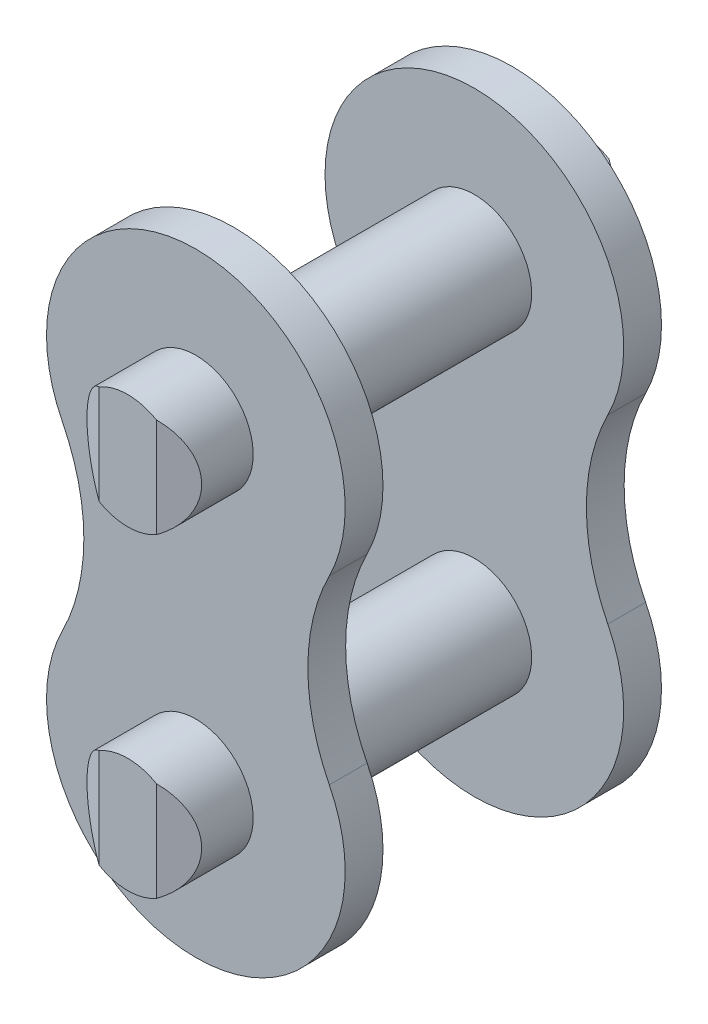
ISO-10303-21;
HEADER;
FILE_DESCRIPTION(('STEP AP214'),'2;1');
FILE_NAME('part.step','',(''),(''),'','','');
FILE_SCHEMA(('AUTOMOTIVE_DESIGN { 1 0 10303 214 1 1 1 1 }'));
ENDSEC;
DATA;
#1=APPLICATION_CONTEXT('core data for automotive mechanical design processes');
#2=APPLICATION_PROTOCOL_DEFINITION('international standard','automotive_design',2000,#1);
#3=PRODUCT_CONTEXT('',#1,'mechanical');
#4=PRODUCT('Part','Part','',(#3));
#5=PRODUCT_RELATED_PRODUCT_CATEGORY('part','',(#4));
#6=PRODUCT_DEFINITION_FORMATION('','',#4);
#7=PRODUCT_DEFINITION_CONTEXT('part definition',#1,'design');
#8=PRODUCT_DEFINITION('design','',#6,#7);
#9=PRODUCT_DEFINITION_SHAPE('','',#8);
#10=(LENGTH_UNIT() NAMED_UNIT(*) SI_UNIT(.MILLI.,.METRE.));
#11=(NAMED_UNIT(*) PLANE_ANGLE_UNIT() SI_UNIT($,.RADIAN.));
#12=(NAMED_UNIT(*) SI_UNIT($,.STERADIAN.) SOLID_ANGLE_UNIT());
#13=UNCERTAINTY_MEASURE_WITH_UNIT(LENGTH_MEASURE(1.E-05),#10,'distance_accuracy_value','');
#14=(GEOMETRIC_REPRESENTATION_CONTEXT(3) GLOBAL_UNCERTAINTY_ASSIGNED_CONTEXT((#13)) GLOBAL_UNIT_ASSIGNED_CONTEXT((#10,
#11,#12)) REPRESENTATION_CONTEXT('',''));
#15=CARTESIAN_POINT('',(0.,0.,0.));
#16=DIRECTION('',(0.,0.,1.));
#17=DIRECTION('',(1.,0.,0.));
#18=AXIS2_PLACEMENT_3D('',#15,#16,#17);
#19=CARTESIAN_POINT('',(133.975475000007,440.089927128475,-131.392489073474));
#20=DIRECTION('',(-0.5,0.,0.866025403784439));
#21=DIRECTION('',(0.,1.,0.));
#22=AXIS2_PLACEMENT_3D('',#19,#20,#21);
#23=PLANE('',#22);
#24=CARTESIAN_POINT('',(133.108700000007,425.587268277526,-131.892921853051));
#25=DIRECTION('',(0.5,0.,-0.866025403784439));
#26=DIRECTION('',(0.866025403784439,0.,0.5));
#27=AXIS2_PLACEMENT_3D('',#24,#25,#26);
#28=ELLIPSE('',#27,1.3344874122049,1.1557);
#29=CARTESIAN_POINT('',(133.686550000007,426.588133836679,-131.5593));
#30=VERTEX_POINT('',#29);
#31=CARTESIAN_POINT('',(133.686550000007,424.586402718372,-131.5593));
#32=VERTEX_POINT('',#31);
#33=EDGE_CURVE('E283',#30,#32,#28,.T.);
#34=ORIENTED_EDGE('',*,*,#33,.T.);
#35=DIRECTION('',(0.,-1.,0.));
#36=VECTOR('',#35,1.);
#37=CARTESIAN_POINT('',(133.686550000007,440.089927128475,-131.5593));
#38=LINE('',#37,#36);
#39=EDGE_CURVE('E238',#30,#32,#38,.T.);
#40=ORIENTED_EDGE('',*,*,#39,.F.);
#41=EDGE_LOOP('',(#34,#40));
#42=FACE_BOUND('',#41,.T.);
#43=ADVANCED_FACE('F17',(#42),#23,.F.);
#44=CARTESIAN_POINT('',(132.241925000007,440.089927128475,-131.392489073474));
#45=DIRECTION('',(-0.5,0.,-0.866025403784439));
#46=DIRECTION('',(-0.866025403784439,0.,0.5));
#47=AXIS2_PLACEMENT_3D('',#44,#45,#46);
#48=PLANE('',#47);
#49=CARTESIAN_POINT('',(133.108700000007,425.587268277526,-131.892921853051));
#50=DIRECTION('',(0.5,0.,0.866025403784439));
#51=DIRECTION('',(-0.866025403784439,0.,0.5));
#52=AXIS2_PLACEMENT_3D('',#49,#50,#51);
#53=ELLIPSE('',#52,1.3344874122049,1.1557);
#54=CARTESIAN_POINT('',(132.530850000007,426.588133836679,-131.5593));
#55=VERTEX_POINT('',#54);
#56=CARTESIAN_POINT('',(132.530850000007,424.586402718372,-131.5593));
#57=VERTEX_POINT('',#56);
#58=EDGE_CURVE('E237',#55,#57,#53,.T.);
#59=ORIENTED_EDGE('',*,*,#58,.F.);
#60=DIRECTION('',(0.,-1.,0.));
#61=VECTOR('',#60,1.);
#62=CARTESIAN_POINT('',(132.530850000007,440.089927128475,-131.5593));
#63=LINE('',#62,#61);
#64=EDGE_CURVE('E240',#55,#57,#63,.T.);
#65=ORIENTED_EDGE('',*,*,#64,.T.);
#66=EDGE_LOOP('',(#59,#65));
#67=FACE_BOUND('',#66,.T.);
#68=ADVANCED_FACE('F19',(#67),#48,.T.);
#69=CARTESIAN_POINT('',(133.975475000007,440.089927128475,-131.392489073474));
#70=DIRECTION('',(-0.5,0.,0.866025403784439));
#71=DIRECTION('',(0.,1.,0.));
#72=AXIS2_PLACEMENT_3D('',#69,#70,#71);
#73=PLANE('',#72);
#74=CARTESIAN_POINT('',(133.108700000007,419.237268277525,-131.892921853051));
#75=DIRECTION('',(0.5,0.,-0.866025403784439));
#76=DIRECTION('',(0.866025403784439,0.,0.5));
#77=AXIS2_PLACEMENT_3D('',#74,#75,#76);
#78=ELLIPSE('',#77,1.3344874122049,1.1557);
#79=CARTESIAN_POINT('',(133.686550000007,420.23813383668,-131.5593));
#80=VERTEX_POINT('',#79);
#81=CARTESIAN_POINT('',(133.686550000007,418.236402718372,-131.5593));
#82=VERTEX_POINT('',#81);
#83=EDGE_CURVE('E311',#80,#82,#78,.T.);
#84=ORIENTED_EDGE('',*,*,#83,.T.);
#85=DIRECTION('',(0.,-1.,0.));
#86=VECTOR('',#85,1.);
#87=CARTESIAN_POINT('',(133.686550000007,440.089927128475,-131.5593));
#88=LINE('',#87,#86);
#89=EDGE_CURVE('E248',#80,#82,#88,.T.);
#90=ORIENTED_EDGE('',*,*,#89,.F.);
#91=EDGE_LOOP('',(#84,#90));
#92=FACE_BOUND('',#91,.T.);
#93=ADVANCED_FACE('F456',(#92),#73,.F.);
#94=CARTESIAN_POINT('',(132.241925000007,440.089927128475,-131.392489073474));
#95=DIRECTION('',(-0.5,0.,-0.866025403784439));
#96=DIRECTION('',(-0.866025403784439,0.,0.5));
#97=AXIS2_PLACEMENT_3D('',#94,#95,#96);
#98=PLANE('',#97);
#99=CARTESIAN_POINT('',(133.108700000007,419.237268277525,-131.892921853051));
#100=DIRECTION('',(0.5,0.,0.866025403784439));
#101=DIRECTION('',(-0.866025403784439,0.,0.5));
#102=AXIS2_PLACEMENT_3D('',#99,#100,#101);
#103=ELLIPSE('',#102,1.3344874122049,1.1557);
#104=CARTESIAN_POINT('',(132.530850000007,420.23813383668,-131.5593));
#105=VERTEX_POINT('',#104);
#106=CARTESIAN_POINT('',(132.530850000007,418.236402718372,-131.5593));
#107=VERTEX_POINT('',#106);
#108=EDGE_CURVE('E291',#105,#107,#103,.T.);
#109=ORIENTED_EDGE('',*,*,#108,.F.);
#110=DIRECTION('',(0.,-1.,0.));
#111=VECTOR('',#110,1.);
#112=CARTESIAN_POINT('',(132.530850000007,440.089927128475,-131.5593));
#113=LINE('',#112,#111);
#114=EDGE_CURVE('E244',#105,#107,#113,.T.);
#115=ORIENTED_EDGE('',*,*,#114,.T.);
#116=EDGE_LOOP('',(#109,#115));
#117=FACE_BOUND('',#116,.T.);
#118=ADVANCED_FACE('F517',(#117),#98,.T.);
#119=CARTESIAN_POINT('',(133.108700000007,422.412268277525,-129.4257));
#120=DIRECTION('',(0.,0.,-1.));
#121=DIRECTION('',(0.,-1.,0.));
#122=AXIS2_PLACEMENT_3D('',#119,#120,#121);
#123=PLANE('',#122);
#124=CARTESIAN_POINT('',(133.108700000007,425.587268277526,-129.4257));
#125=DIRECTION('',(0.,0.,1.));
#126=DIRECTION('',(0.,-1.,0.));
#127=AXIS2_PLACEMENT_3D('',#124,#125,#126);
#128=CIRCLE('',#127,1.1557);
#129=CARTESIAN_POINT('',(133.108700000007,424.431568277526,-129.4257));
#130=VERTEX_POINT('',#129);
#131=EDGE_CURVE('E263',#130,#130,#128,.T.);
#132=ORIENTED_EDGE('',*,*,#131,.F.);
#133=EDGE_LOOP('',(#132));
#134=FACE_BOUND('',#133,.T.);
#135=CARTESIAN_POINT('',(133.108700000007,419.237268277525,-129.4257));
#136=DIRECTION('',(0.,0.,1.));
#137=DIRECTION('',(0.,-1.,0.));
#138=AXIS2_PLACEMENT_3D('',#135,#136,#137);
#139=CIRCLE('',#138,1.1557);
#140=CARTESIAN_POINT('',(133.108700000007,418.081568277526,-129.4257));
#141=VERTEX_POINT('',#140);
#142=EDGE_CURVE('E267',#141,#141,#139,.T.);
#143=ORIENTED_EDGE('',*,*,#142,.F.);
#144=EDGE_LOOP('',(#143));
#145=FACE_BOUND('',#144,.T.);
#146=CARTESIAN_POINT('',(126.78662526372,422.412268277525,-129.4257));
#147=DIRECTION('',(0.,0.,1.));
#148=DIRECTION('',(0.,-1.,0.));
#149=AXIS2_PLACEMENT_3D('',#146,#147,#148);
#150=CIRCLE('',#149,4.06464973628698);
#151=CARTESIAN_POINT('',(130.418943979048,420.588086754493,-129.4257));
#152=VERTEX_POINT('',#151);
#153=CARTESIAN_POINT('',(130.418943979048,424.236449800559,-129.4257));
#154=VERTEX_POINT('',#153);
#155=EDGE_CURVE('E247',#152,#154,#150,.T.);
#156=ORIENTED_EDGE('',*,*,#155,.F.);
#157=CARTESIAN_POINT('',(133.108700000007,419.237268277525,-129.4257));
#158=DIRECTION('',(0.,0.,1.));
#159=DIRECTION('',(0.,-1.,0.));
#160=AXIS2_PLACEMENT_3D('',#157,#158,#159);
#161=CIRCLE('',#160,3.0099);
#162=CARTESIAN_POINT('',(135.798456020965,420.588086754493,-129.4257));
#163=VERTEX_POINT('',#162);
#164=EDGE_CURVE('E330',#152,#163,#161,.T.);
#165=ORIENTED_EDGE('',*,*,#164,.T.);
#166=CARTESIAN_POINT('',(139.430774736293,422.412268277525,-129.4257));
#167=DIRECTION('',(0.,0.,1.));
#168=DIRECTION('',(0.,-1.,0.));
#169=AXIS2_PLACEMENT_3D('',#166,#167,#168);
#170=CIRCLE('',#169,4.06464973628691);
#171=CARTESIAN_POINT('',(135.798456020965,424.236449800559,-129.4257));
#172=VERTEX_POINT('',#171);
#173=EDGE_CURVE('E304',#172,#163,#170,.T.);
#174=ORIENTED_EDGE('',*,*,#173,.F.);
#175=CARTESIAN_POINT('',(133.108700000007,425.587268277526,-129.4257));
#176=DIRECTION('',(0.,0.,1.));
#177=DIRECTION('',(0.,-1.,0.));
#178=AXIS2_PLACEMENT_3D('',#175,#176,#177);
#179=CIRCLE('',#178,3.0099);
#180=EDGE_CURVE('E26',#172,#154,#179,.T.);
#181=ORIENTED_EDGE('',*,*,#180,.T.);
#182=EDGE_LOOP('',(#156,#165,#174,#181));
#183=FACE_BOUND('',#182,.T.);
#184=ADVANCED_FACE('F513',(#134,#145,#183),#123,.F.);
#185=CARTESIAN_POINT('',(133.108700000007,422.412268277525,-130.1877));
#186=DIRECTION('',(0.,0.,-1.));
#187=DIRECTION('',(0.,-1.,0.));
#188=AXIS2_PLACEMENT_3D('',#185,#186,#187);
#189=PLANE('',#188);
#190=CARTESIAN_POINT('',(133.108700000007,425.587268277526,-130.1877));
#191=DIRECTION('',(0.,0.,1.));
#192=DIRECTION('',(0.,-1.,0.));
#193=AXIS2_PLACEMENT_3D('',#190,#191,#192);
#194=CIRCLE('',#193,1.1557);
#195=CARTESIAN_POINT('',(133.108700000007,424.431568277526,-130.1877));
#196=VERTEX_POINT('',#195);
#197=EDGE_CURVE('E266',#196,#196,#194,.T.);
#198=ORIENTED_EDGE('',*,*,#197,.T.);
#199=EDGE_LOOP('',(#198));
#200=FACE_BOUND('',#199,.T.);
#201=CARTESIAN_POINT('',(133.108700000007,419.237268277525,-130.1877));
#202=DIRECTION('',(0.,0.,1.));
#203=DIRECTION('',(0.,-1.,0.));
#204=AXIS2_PLACEMENT_3D('',#201,#202,#203);
#205=CIRCLE('',#204,1.1557);
#206=CARTESIAN_POINT('',(133.108700000007,418.081568277526,-130.1877));
#207=VERTEX_POINT('',#206);
#208=EDGE_CURVE('E308',#207,#207,#205,.T.);
#209=ORIENTED_EDGE('',*,*,#208,.T.);
#210=EDGE_LOOP('',(#209));
#211=FACE_BOUND('',#210,.T.);
#212=CARTESIAN_POINT('',(126.78662526372,422.412268277525,-130.1877));
#213=DIRECTION('',(0.,0.,1.));
#214=DIRECTION('',(0.,-1.,0.));
#215=AXIS2_PLACEMENT_3D('',#212,#213,#214);
#216=CIRCLE('',#215,4.06464973628698);
#217=CARTESIAN_POINT('',(130.418943979048,420.588086754493,-130.1877));
#218=VERTEX_POINT('',#217);
#219=CARTESIAN_POINT('',(130.418943979048,424.236449800559,-130.1877));
#220=VERTEX_POINT('',#219);
#221=EDGE_CURVE('E323',#218,#220,#216,.T.);
#222=ORIENTED_EDGE('',*,*,#221,.T.);
#223=CARTESIAN_POINT('',(133.108700000007,425.587268277526,-130.1877));
#224=DIRECTION('',(0.,0.,1.));
#225=DIRECTION('',(0.,-1.,0.));
#226=AXIS2_PLACEMENT_3D('',#223,#224,#225);
#227=CIRCLE('',#226,3.0099);
#228=CARTESIAN_POINT('',(135.798456020965,424.236449800559,-130.1877));
#229=VERTEX_POINT('',#228);
#230=EDGE_CURVE('E11',#229,#220,#227,.T.);
#231=ORIENTED_EDGE('',*,*,#230,.F.);
#232=CARTESIAN_POINT('',(139.430774736293,422.412268277525,-130.1877));
#233=DIRECTION('',(0.,0.,1.));
#234=DIRECTION('',(0.,-1.,0.));
#235=AXIS2_PLACEMENT_3D('',#232,#233,#234);
#236=CIRCLE('',#235,4.06464973628691);
#237=CARTESIAN_POINT('',(135.798456020965,420.588086754493,-130.1877));
#238=VERTEX_POINT('',#237);
#239=EDGE_CURVE('E338',#229,#238,#236,.T.);
#240=ORIENTED_EDGE('',*,*,#239,.T.);
#241=CARTESIAN_POINT('',(133.108700000007,419.237268277525,-130.1877));
#242=DIRECTION('',(0.,0.,1.));
#243=DIRECTION('',(0.,-1.,0.));
#244=AXIS2_PLACEMENT_3D('',#241,#242,#243);
#245=CIRCLE('',#244,3.0099);
#246=EDGE_CURVE('E305',#218,#238,#245,.T.);
#247=ORIENTED_EDGE('',*,*,#246,.F.);
#248=EDGE_LOOP('',(#222,#231,#240,#247));
#249=FACE_BOUND('',#248,.T.);
#250=ADVANCED_FACE('F516',(#200,#211,#249),#189,.T.);
#251=CARTESIAN_POINT('',(133.108700000007,425.587268277526,-130.1877));
#252=DIRECTION('',(0.,0.,1.));
#253=DIRECTION('',(0.,1.,0.));
#254=AXIS2_PLACEMENT_3D('',#251,#252,#253);
#255=CYLINDRICAL_SURFACE('',#254,3.0099);
#256=ORIENTED_EDGE('',*,*,#180,.F.);
#257=DIRECTION('',(0.,0.,1.));
#258=VECTOR('',#257,1.);
#259=CARTESIAN_POINT('',(135.798456020965,424.236449800559,-130.1877));
#260=LINE('',#259,#258);
#261=EDGE_CURVE('E336',#229,#172,#260,.T.);
#262=ORIENTED_EDGE('',*,*,#261,.F.);
#263=ORIENTED_EDGE('',*,*,#230,.T.);
#264=DIRECTION('',(0.,0.,1.));
#265=VECTOR('',#264,1.);
#266=CARTESIAN_POINT('',(130.418943979048,424.236449800559,-130.1877));
#267=LINE('',#266,#265);
#268=EDGE_CURVE('E320',#220,#154,#267,.T.);
#269=ORIENTED_EDGE('',*,*,#268,.T.);
#270=EDGE_LOOP('',(#256,#262,#263,#269));
#271=FACE_BOUND('',#270,.T.);
#272=ADVANCED_FACE('F536',(#271),#255,.T.);
#273=CARTESIAN_POINT('',(139.430774736293,422.412268277525,-130.1877));
#274=DIRECTION('',(0.,0.,1.));
#275=DIRECTION('',(0.,1.,0.));
#276=AXIS2_PLACEMENT_3D('',#273,#274,#275);
#277=CYLINDRICAL_SURFACE('',#276,4.06464973628691);
#278=ORIENTED_EDGE('',*,*,#173,.T.);
#279=DIRECTION('',(0.,0.,1.));
#280=VECTOR('',#279,1.);
#281=CARTESIAN_POINT('',(135.798456020965,420.588086754493,-130.1877));
#282=LINE('',#281,#280);
#283=EDGE_CURVE('E300',#238,#163,#282,.T.);
#284=ORIENTED_EDGE('',*,*,#283,.F.);
#285=ORIENTED_EDGE('',*,*,#239,.F.);
#286=ORIENTED_EDGE('',*,*,#261,.T.);
#287=EDGE_LOOP('',(#278,#284,#285,#286));
#288=FACE_BOUND('',#287,.T.);
#289=ADVANCED_FACE('F532',(#288),#277,.F.);
#290=CARTESIAN_POINT('',(133.108700000007,419.237268277525,-130.1877));
#291=DIRECTION('',(0.,0.,1.));
#292=DIRECTION('',(0.,1.,0.));
#293=AXIS2_PLACEMENT_3D('',#290,#291,#292);
#294=CYLINDRICAL_SURFACE('',#293,3.0099);
#295=ORIENTED_EDGE('',*,*,#164,.F.);
#296=DIRECTION('',(0.,0.,1.));
#297=VECTOR('',#296,1.);
#298=CARTESIAN_POINT('',(130.418943979048,420.588086754493,-130.1877));
#299=LINE('',#298,#297);
#300=EDGE_CURVE('E326',#218,#152,#299,.T.);
#301=ORIENTED_EDGE('',*,*,#300,.F.);
#302=ORIENTED_EDGE('',*,*,#246,.T.);
#303=ORIENTED_EDGE('',*,*,#283,.T.);
#304=EDGE_LOOP('',(#295,#301,#302,#303));
#305=FACE_BOUND('',#304,.T.);
#306=ADVANCED_FACE('F528',(#305),#294,.T.);
#307=CARTESIAN_POINT('',(126.78662526372,422.412268277525,-130.1877));
#308=DIRECTION('',(0.,0.,1.));
#309=DIRECTION('',(0.,1.,0.));
#310=AXIS2_PLACEMENT_3D('',#307,#308,#309);
#311=CYLINDRICAL_SURFACE('',#310,4.06464973628698);
#312=ORIENTED_EDGE('',*,*,#155,.T.);
#313=ORIENTED_EDGE('',*,*,#268,.F.);
#314=ORIENTED_EDGE('',*,*,#221,.F.);
#315=ORIENTED_EDGE('',*,*,#300,.T.);
#316=EDGE_LOOP('',(#312,#313,#314,#315));
#317=FACE_BOUND('',#316,.T.);
#318=ADVANCED_FACE('F524',(#317),#311,.F.);
#319=CARTESIAN_POINT('',(133.108700000007,422.412268277525,-131.5593));
#320=DIRECTION('',(0.,0.,-1.));
#321=DIRECTION('',(0.,-1.,0.));
#322=AXIS2_PLACEMENT_3D('',#319,#320,#321);
#323=PLANE('',#322);
#324=ORIENTED_EDGE('',*,*,#89,.T.);
#325=CARTESIAN_POINT('',(133.108700000007,419.237268277525,-131.5593));
#326=DIRECTION('',(0.,0.,1.));
#327=DIRECTION('',(0.,-1.,0.));
#328=AXIS2_PLACEMENT_3D('',#325,#326,#327);
#329=CIRCLE('',#328,1.1557);
#330=EDGE_CURVE('E295',#107,#82,#329,.T.);
#331=ORIENTED_EDGE('',*,*,#330,.F.);
#332=ORIENTED_EDGE('',*,*,#114,.F.);
#333=CARTESIAN_POINT('',(133.108700000007,419.237268277525,-131.5593));
#334=DIRECTION('',(0.,0.,1.));
#335=DIRECTION('',(0.,-1.,0.));
#336=AXIS2_PLACEMENT_3D('',#333,#334,#335);
#337=CIRCLE('',#336,1.1557);
#338=EDGE_CURVE('E296',#80,#105,#337,.T.);
#339=ORIENTED_EDGE('',*,*,#338,.F.);
#340=EDGE_LOOP('',(#324,#331,#332,#339));
#341=FACE_BOUND('',#340,.T.);
#342=ADVANCED_FACE('F521',(#341),#323,.T.);
#343=CARTESIAN_POINT('',(133.108700000007,419.237268277525,-131.5593));
#344=DIRECTION('',(0.,0.,1.));
#345=DIRECTION('',(0.,1.,0.));
#346=AXIS2_PLACEMENT_3D('',#343,#344,#345);
#347=CYLINDRICAL_SURFACE('',#346,1.1557);
#348=ORIENTED_EDGE('',*,*,#83,.F.);
#349=ORIENTED_EDGE('',*,*,#338,.T.);
#350=ORIENTED_EDGE('',*,*,#108,.T.);
#351=ORIENTED_EDGE('',*,*,#330,.T.);
#352=EDGE_LOOP('',(#348,#349,#350,#351));
#353=FACE_BOUND('',#352,.T.);
#354=ORIENTED_EDGE('',*,*,#208,.F.);
#355=EDGE_LOOP('',(#354));
#356=FACE_BOUND('',#355,.T.);
#357=ADVANCED_FACE('F508',(#353,#356),#347,.T.);
#358=CARTESIAN_POINT('',(133.108700000007,422.412268277525,-131.5593));
#359=DIRECTION('',(0.,0.,-1.));
#360=DIRECTION('',(0.,-1.,0.));
#361=AXIS2_PLACEMENT_3D('',#358,#359,#360);
#362=PLANE('',#361);
#363=ORIENTED_EDGE('',*,*,#39,.T.);
#364=CARTESIAN_POINT('',(133.108700000007,425.587268277526,-131.5593));
#365=DIRECTION('',(0.,0.,1.));
#366=DIRECTION('',(0.,-1.,0.));
#367=AXIS2_PLACEMENT_3D('',#364,#365,#366);
#368=CIRCLE('',#367,1.1557);
#369=EDGE_CURVE('E241',#57,#32,#368,.T.);
#370=ORIENTED_EDGE('',*,*,#369,.F.);
#371=ORIENTED_EDGE('',*,*,#64,.F.);
#372=CARTESIAN_POINT('',(133.108700000007,425.587268277526,-131.5593));
#373=DIRECTION('',(0.,0.,1.));
#374=DIRECTION('',(0.,-1.,0.));
#375=AXIS2_PLACEMENT_3D('',#372,#373,#374);
#376=CIRCLE('',#375,1.1557);
#377=EDGE_CURVE('E287',#30,#55,#376,.T.);
#378=ORIENTED_EDGE('',*,*,#377,.F.);
#379=EDGE_LOOP('',(#363,#370,#371,#378));
#380=FACE_BOUND('',#379,.T.);
#381=ADVANCED_FACE('F505',(#380),#362,.T.);
#382=CARTESIAN_POINT('',(133.108700000007,425.587268277526,-131.5593));
#383=DIRECTION('',(0.,0.,1.));
#384=DIRECTION('',(0.,1.,0.));
#385=AXIS2_PLACEMENT_3D('',#382,#383,#384);
#386=CYLINDRICAL_SURFACE('',#385,1.1557);
#387=ORIENTED_EDGE('',*,*,#33,.F.);
#388=ORIENTED_EDGE('',*,*,#377,.T.);
#389=ORIENTED_EDGE('',*,*,#58,.T.);
#390=ORIENTED_EDGE('',*,*,#369,.T.);
#391=EDGE_LOOP('',(#387,#388,#389,#390));
#392=FACE_BOUND('',#391,.T.);
#393=ORIENTED_EDGE('',*,*,#197,.F.);
#394=EDGE_LOOP('',(#393));
#395=FACE_BOUND('',#394,.T.);
#396=ADVANCED_FACE('F445',(#392,#395),#386,.T.);
#397=CARTESIAN_POINT('',(133.975475000007,440.089927128475,-122.607510926526));
#398=DIRECTION('',(-0.5,0.,-0.866025403784439));
#399=DIRECTION('',(-0.866025403784439,0.,0.5));
#400=AXIS2_PLACEMENT_3D('',#397,#398,#399);
#401=PLANE('',#400);
#402=CARTESIAN_POINT('',(133.108700000007,425.587268277526,-122.107078146949));
#403=DIRECTION('',(-0.5,0.,-0.866025403784439));
#404=DIRECTION('',(0.866025403784439,0.,-0.5));
#405=AXIS2_PLACEMENT_3D('',#402,#403,#404);
#406=ELLIPSE('',#405,1.3344874122049,1.1557);
#407=CARTESIAN_POINT('',(133.686550000007,426.588133836679,-122.4407));
#408=VERTEX_POINT('',#407);
#409=CARTESIAN_POINT('',(133.686550000007,424.586402718372,-122.4407));
#410=VERTEX_POINT('',#409);
#411=EDGE_CURVE('E385',#408,#410,#406,.T.);
#412=ORIENTED_EDGE('',*,*,#411,.F.);
#413=DIRECTION('',(0.,-1.,0.));
#414=VECTOR('',#413,1.);
#415=CARTESIAN_POINT('',(133.686550000007,440.089927128475,-122.4407));
#416=LINE('',#415,#414);
#417=EDGE_CURVE('E355',#408,#410,#416,.T.);
#418=ORIENTED_EDGE('',*,*,#417,.T.);
#419=EDGE_LOOP('',(#412,#418));
#420=FACE_BOUND('',#419,.T.);
#421=ADVANCED_FACE('F435',(#420),#401,.F.);
#422=CARTESIAN_POINT('',(132.241925000007,440.089927128475,-122.607510926526));
#423=DIRECTION('',(-0.5,0.,0.866025403784439));
#424=DIRECTION('',(0.,1.,0.));
#425=AXIS2_PLACEMENT_3D('',#422,#423,#424);
#426=PLANE('',#425);
#427=CARTESIAN_POINT('',(133.108700000007,425.587268277526,-122.107078146949));
#428=DIRECTION('',(-0.5,0.,0.866025403784439));
#429=DIRECTION('',(-0.866025403784439,0.,-0.5));
#430=AXIS2_PLACEMENT_3D('',#427,#428,#429);
#431=ELLIPSE('',#430,1.3344874122049,1.1557);
#432=CARTESIAN_POINT('',(132.530850000007,426.588133836679,-122.4407));
#433=VERTEX_POINT('',#432);
#434=CARTESIAN_POINT('',(132.530850000007,424.586402718372,-122.4407));
#435=VERTEX_POINT('',#434);
#436=EDGE_CURVE('E388',#433,#435,#431,.T.);
#437=ORIENTED_EDGE('',*,*,#436,.T.);
#438=DIRECTION('',(0.,-1.,0.));
#439=VECTOR('',#438,1.);
#440=CARTESIAN_POINT('',(132.530850000007,440.089927128475,-122.4407));
#441=LINE('',#440,#439);
#442=EDGE_CURVE('E357',#433,#435,#441,.T.);
#443=ORIENTED_EDGE('',*,*,#442,.F.);
#444=EDGE_LOOP('',(#437,#443));
#445=FACE_BOUND('',#444,.T.);
#446=ADVANCED_FACE('F432',(#445),#426,.T.);
#447=CARTESIAN_POINT('',(133.975475000007,440.089927128475,-122.607510926526));
#448=DIRECTION('',(-0.5,0.,-0.866025403784439));
#449=DIRECTION('',(-0.866025403784439,0.,0.5));
#450=AXIS2_PLACEMENT_3D('',#447,#448,#449);
#451=PLANE('',#450);
#452=CARTESIAN_POINT('',(133.108700000007,419.237268277525,-122.107078146949));
#453=DIRECTION('',(-0.5,0.,-0.866025403784439));
#454=DIRECTION('',(0.866025403784439,0.,-0.5));
#455=AXIS2_PLACEMENT_3D('',#452,#453,#454);
#456=ELLIPSE('',#455,1.3344874122049,1.1557);
#457=CARTESIAN_POINT('',(133.686550000007,420.23813383668,-122.4407));
#458=VERTEX_POINT('',#457);
#459=CARTESIAN_POINT('',(133.686550000007,418.236402718372,-122.4407));
#460=VERTEX_POINT('',#459);
#461=EDGE_CURVE('E362',#458,#460,#456,.T.);
#462=ORIENTED_EDGE('',*,*,#461,.F.);
#463=DIRECTION('',(0.,-1.,0.));
#464=VECTOR('',#463,1.);
#465=CARTESIAN_POINT('',(133.686550000007,440.089927128475,-122.4407));
#466=LINE('',#465,#464);
#467=EDGE_CURVE('E233',#458,#460,#466,.T.);
#468=ORIENTED_EDGE('',*,*,#467,.T.);
#469=EDGE_LOOP('',(#462,#468));
#470=FACE_BOUND('',#469,.T.);
#471=ADVANCED_FACE('F434',(#470),#451,.F.);
#472=CARTESIAN_POINT('',(132.241925000007,440.089927128475,-122.607510926526));
#473=DIRECTION('',(-0.5,0.,0.866025403784439));
#474=DIRECTION('',(0.,1.,0.));
#475=AXIS2_PLACEMENT_3D('',#472,#473,#474);
#476=PLANE('',#475);
#477=CARTESIAN_POINT('',(133.108700000007,419.237268277525,-122.107078146949));
#478=DIRECTION('',(-0.5,0.,0.866025403784439));
#479=DIRECTION('',(-0.866025403784439,0.,-0.5));
#480=AXIS2_PLACEMENT_3D('',#477,#478,#479);
#481=ELLIPSE('',#480,1.3344874122049,1.1557);
#482=CARTESIAN_POINT('',(132.530850000007,420.23813383668,-122.4407));
#483=VERTEX_POINT('',#482);
#484=CARTESIAN_POINT('',(132.530850000007,418.236402718372,-122.4407));
#485=VERTEX_POINT('',#484);
#486=EDGE_CURVE('E366',#483,#485,#481,.T.);
#487=ORIENTED_EDGE('',*,*,#486,.T.);
#488=DIRECTION('',(0.,-1.,0.));
#489=VECTOR('',#488,1.);
#490=CARTESIAN_POINT('',(132.530850000007,440.089927128475,-122.4407));
#491=LINE('',#490,#489);
#492=EDGE_CURVE('E227',#483,#485,#491,.T.);
#493=ORIENTED_EDGE('',*,*,#492,.F.);
#494=EDGE_LOOP('',(#487,#493));
#495=FACE_BOUND('',#494,.T.);
#496=ADVANCED_FACE('F442',(#495),#476,.T.);
#497=CARTESIAN_POINT('',(133.108700000007,425.587268277526,-122.4407));
#498=DIRECTION('',(0.,0.,-1.));
#499=DIRECTION('',(0.,1.,0.));
#500=AXIS2_PLACEMENT_3D('',#497,#498,#499);
#501=CYLINDRICAL_SURFACE('',#500,1.1557);
#502=ORIENTED_EDGE('',*,*,#131,.T.);
#503=EDGE_LOOP('',(#502));
#504=FACE_BOUND('',#503,.T.);
#505=CARTESIAN_POINT('',(133.108700000007,425.587268277526,-124.5743));
#506=DIRECTION('',(0.,0.,1.));
#507=DIRECTION('',(0.,-1.,0.));
#508=AXIS2_PLACEMENT_3D('',#505,#506,#507);
#509=CIRCLE('',#508,1.1557);
#510=CARTESIAN_POINT('',(133.108700000007,424.431568277526,-124.5743));
#511=VERTEX_POINT('',#510);
#512=EDGE_CURVE('E278',#511,#511,#509,.T.);
#513=ORIENTED_EDGE('',*,*,#512,.F.);
#514=EDGE_LOOP('',(#513));
#515=FACE_BOUND('',#514,.T.);
#516=ADVANCED_FACE('F498',(#504,#515),#501,.T.);
#517=CARTESIAN_POINT('',(133.108700000007,419.237268277525,-122.4407));
#518=DIRECTION('',(0.,0.,-1.));
#519=DIRECTION('',(0.,1.,0.));
#520=AXIS2_PLACEMENT_3D('',#517,#518,#519);
#521=CYLINDRICAL_SURFACE('',#520,1.1557);
#522=ORIENTED_EDGE('',*,*,#142,.T.);
#523=EDGE_LOOP('',(#522));
#524=FACE_BOUND('',#523,.T.);
#525=CARTESIAN_POINT('',(133.108700000007,419.237268277525,-124.5743));
#526=DIRECTION('',(0.,0.,1.));
#527=DIRECTION('',(0.,-1.,0.));
#528=AXIS2_PLACEMENT_3D('',#525,#526,#527);
#529=CIRCLE('',#528,1.1557);
#530=CARTESIAN_POINT('',(133.108700000007,418.081568277526,-124.5743));
#531=VERTEX_POINT('',#530);
#532=EDGE_CURVE('E252',#531,#531,#529,.T.);
#533=ORIENTED_EDGE('',*,*,#532,.F.);
#534=EDGE_LOOP('',(#533));
#535=FACE_BOUND('',#534,.T.);
#536=ADVANCED_FACE('F495',(#524,#535),#521,.T.);
#537=CARTESIAN_POINT('',(133.108700000007,422.412268277525,-124.5743));
#538=DIRECTION('',(0.,0.,1.));
#539=DIRECTION('',(1.,0.,0.));
#540=AXIS2_PLACEMENT_3D('',#537,#538,#539);
#541=PLANE('',#540);
#542=ORIENTED_EDGE('',*,*,#512,.T.);
#543=EDGE_LOOP('',(#542));
#544=FACE_BOUND('',#543,.T.);
#545=ORIENTED_EDGE('',*,*,#532,.T.);
#546=EDGE_LOOP('',(#545));
#547=FACE_BOUND('',#546,.T.);
#548=CARTESIAN_POINT('',(126.78662526372,422.412268277525,-124.5743));
#549=DIRECTION('',(0.,0.,1.));
#550=DIRECTION('',(0.,-1.,0.));
#551=AXIS2_PLACEMENT_3D('',#548,#549,#550);
#552=CIRCLE('',#551,4.06464973628698);
#553=CARTESIAN_POINT('',(130.418943979048,420.588086754493,-124.5743));
#554=VERTEX_POINT('',#553);
#555=CARTESIAN_POINT('',(130.418943979048,424.236449800559,-124.5743));
#556=VERTEX_POINT('',#555);
#557=EDGE_CURVE('E202',#554,#556,#552,.T.);
#558=ORIENTED_EDGE('',*,*,#557,.T.);
#559=CARTESIAN_POINT('',(133.108700000007,425.587268277526,-124.5743));
#560=DIRECTION('',(0.,0.,1.));
#561=DIRECTION('',(0.,-1.,0.));
#562=AXIS2_PLACEMENT_3D('',#559,#560,#561);
#563=CIRCLE('',#562,3.0099);
#564=CARTESIAN_POINT('',(135.798456020965,424.236449800559,-124.5743));
#565=VERTEX_POINT('',#564);
#566=EDGE_CURVE('E253',#565,#556,#563,.T.);
#567=ORIENTED_EDGE('',*,*,#566,.F.);
#568=CARTESIAN_POINT('',(139.430774736293,422.412268277525,-124.5743));
#569=DIRECTION('',(0.,0.,1.));
#570=DIRECTION('',(0.,-1.,0.));
#571=AXIS2_PLACEMENT_3D('',#568,#569,#570);
#572=CIRCLE('',#571,4.06464973628691);
#573=CARTESIAN_POINT('',(135.798456020965,420.588086754493,-124.5743));
#574=VERTEX_POINT('',#573);
#575=EDGE_CURVE('E204',#565,#574,#572,.T.);
#576=ORIENTED_EDGE('',*,*,#575,.T.);
#577=CARTESIAN_POINT('',(133.108700000007,419.237268277525,-124.5743));
#578=DIRECTION('',(0.,0.,1.));
#579=DIRECTION('',(0.,-1.,0.));
#580=AXIS2_PLACEMENT_3D('',#577,#578,#579);
#581=CIRCLE('',#580,3.0099);
#582=EDGE_CURVE('E198',#554,#574,#581,.T.);
#583=ORIENTED_EDGE('',*,*,#582,.F.);
#584=EDGE_LOOP('',(#558,#567,#576,#583));
#585=FACE_BOUND('',#584,.T.);
#586=ADVANCED_FACE('F200',(#544,#547,#585),#541,.F.);
#587=CARTESIAN_POINT('',(133.108700000007,422.412268277525,-123.8123));
#588=DIRECTION('',(0.,0.,1.));
#589=DIRECTION('',(1.,0.,0.));
#590=AXIS2_PLACEMENT_3D('',#587,#588,#589);
#591=PLANE('',#590);
#592=CARTESIAN_POINT('',(133.108700000007,425.587268277526,-123.8123));
#593=DIRECTION('',(0.,0.,1.));
#594=DIRECTION('',(0.,-1.,0.));
#595=AXIS2_PLACEMENT_3D('',#592,#593,#594);
#596=CIRCLE('',#595,1.1557);
#597=CARTESIAN_POINT('',(133.108700000007,424.431568277526,-123.8123));
#598=VERTEX_POINT('',#597);
#599=EDGE_CURVE('E414',#598,#598,#596,.T.);
#600=ORIENTED_EDGE('',*,*,#599,.F.);
#601=EDGE_LOOP('',(#600));
#602=FACE_BOUND('',#601,.T.);
#603=CARTESIAN_POINT('',(133.108700000007,419.237268277525,-123.8123));
#604=DIRECTION('',(0.,0.,1.));
#605=DIRECTION('',(0.,-1.,0.));
#606=AXIS2_PLACEMENT_3D('',#603,#604,#605);
#607=CIRCLE('',#606,1.1557);
#608=CARTESIAN_POINT('',(133.108700000007,418.081568277526,-123.8123));
#609=VERTEX_POINT('',#608);
#610=EDGE_CURVE('E359',#609,#609,#607,.T.);
#611=ORIENTED_EDGE('',*,*,#610,.F.);
#612=EDGE_LOOP('',(#611));
#613=FACE_BOUND('',#612,.T.);
#614=CARTESIAN_POINT('',(126.78662526372,422.412268277525,-123.8123));
#615=DIRECTION('',(0.,0.,1.));
#616=DIRECTION('',(0.,-1.,0.));
#617=AXIS2_PLACEMENT_3D('',#614,#615,#616);
#618=CIRCLE('',#617,4.06464973628698);
#619=CARTESIAN_POINT('',(130.418943979048,420.588086754493,-123.8123));
#620=VERTEX_POINT('',#619);
#621=CARTESIAN_POINT('',(130.418943979048,424.236449800559,-123.8123));
#622=VERTEX_POINT('',#621);
#623=EDGE_CURVE('E221',#620,#622,#618,.T.);
#624=ORIENTED_EDGE('',*,*,#623,.F.);
#625=CARTESIAN_POINT('',(133.108700000007,419.237268277525,-123.8123));
#626=DIRECTION('',(0.,0.,1.));
#627=DIRECTION('',(0.,-1.,0.));
#628=AXIS2_PLACEMENT_3D('',#625,#626,#627);
#629=CIRCLE('',#628,3.0099);
#630=CARTESIAN_POINT('',(135.798456020965,420.588086754493,-123.8123));
#631=VERTEX_POINT('',#630);
#632=EDGE_CURVE('E216',#620,#631,#629,.T.);
#633=ORIENTED_EDGE('',*,*,#632,.T.);
#634=CARTESIAN_POINT('',(139.430774736293,422.412268277525,-123.8123));
#635=DIRECTION('',(0.,0.,1.));
#636=DIRECTION('',(0.,-1.,0.));
#637=AXIS2_PLACEMENT_3D('',#634,#635,#636);
#638=CIRCLE('',#637,4.06464973628691);
#639=CARTESIAN_POINT('',(135.798456020965,424.236449800559,-123.8123));
#640=VERTEX_POINT('',#639);
#641=EDGE_CURVE('E259',#640,#631,#638,.T.);
#642=ORIENTED_EDGE('',*,*,#641,.F.);
#643=CARTESIAN_POINT('',(133.108700000007,425.587268277526,-123.8123));
#644=DIRECTION('',(0.,0.,1.));
#645=DIRECTION('',(0.,-1.,0.));
#646=AXIS2_PLACEMENT_3D('',#643,#644,#645);
#647=CIRCLE('',#646,3.0099);
#648=EDGE_CURVE('E249',#640,#622,#647,.T.);
#649=ORIENTED_EDGE('',*,*,#648,.T.);
#650=EDGE_LOOP('',(#624,#633,#642,#649));
#651=FACE_BOUND('',#650,.T.);
#652=ADVANCED_FACE('F473',(#602,#613,#651),#591,.T.);
#653=CARTESIAN_POINT('',(133.108700000007,425.587268277526,-123.8123));
#654=DIRECTION('',(0.,0.,-1.));
#655=DIRECTION('',(0.,1.,0.));
#656=AXIS2_PLACEMENT_3D('',#653,#654,#655);
#657=CYLINDRICAL_SURFACE('',#656,3.0099);
#658=ORIENTED_EDGE('',*,*,#566,.T.);
#659=DIRECTION('',(0.,0.,-1.));
#660=VECTOR('',#659,1.);
#661=CARTESIAN_POINT('',(130.418943979048,424.236449800559,-123.8123));
#662=LINE('',#661,#660);
#663=EDGE_CURVE('E210',#622,#556,#662,.T.);
#664=ORIENTED_EDGE('',*,*,#663,.F.);
#665=ORIENTED_EDGE('',*,*,#648,.F.);
#666=DIRECTION('',(0.,0.,-1.));
#667=VECTOR('',#666,1.);
#668=CARTESIAN_POINT('',(135.798456020965,424.236449800559,-123.8123));
#669=LINE('',#668,#667);
#670=EDGE_CURVE('E256',#640,#565,#669,.T.);
#671=ORIENTED_EDGE('',*,*,#670,.T.);
#672=EDGE_LOOP('',(#658,#664,#665,#671));
#673=FACE_BOUND('',#672,.T.);
#674=ADVANCED_FACE('F476',(#673),#657,.T.);
#675=CARTESIAN_POINT('',(139.430774736293,422.412268277525,-123.8123));
#676=DIRECTION('',(0.,0.,-1.));
#677=DIRECTION('',(0.,1.,0.));
#678=AXIS2_PLACEMENT_3D('',#675,#676,#677);
#679=CYLINDRICAL_SURFACE('',#678,4.06464973628691);
#680=ORIENTED_EDGE('',*,*,#575,.F.);
#681=ORIENTED_EDGE('',*,*,#670,.F.);
#682=ORIENTED_EDGE('',*,*,#641,.T.);
#683=DIRECTION('',(0.,0.,-1.));
#684=VECTOR('',#683,1.);
#685=CARTESIAN_POINT('',(135.798456020965,420.588086754493,-123.8123));
#686=LINE('',#685,#684);
#687=EDGE_CURVE('E209',#631,#574,#686,.T.);
#688=ORIENTED_EDGE('',*,*,#687,.T.);
#689=EDGE_LOOP('',(#680,#681,#682,#688));
#690=FACE_BOUND('',#689,.T.);
#691=ADVANCED_FACE('F483',(#690),#679,.F.);
#692=CARTESIAN_POINT('',(133.108700000007,419.237268277525,-123.8123));
#693=DIRECTION('',(0.,0.,-1.));
#694=DIRECTION('',(0.,1.,0.));
#695=AXIS2_PLACEMENT_3D('',#692,#693,#694);
#696=CYLINDRICAL_SURFACE('',#695,3.0099);
#697=ORIENTED_EDGE('',*,*,#582,.T.);
#698=ORIENTED_EDGE('',*,*,#687,.F.);
#699=ORIENTED_EDGE('',*,*,#632,.F.);
#700=DIRECTION('',(0.,0.,-1.));
#701=VECTOR('',#700,1.);
#702=CARTESIAN_POINT('',(130.418943979048,420.588086754493,-123.8123));
#703=LINE('',#702,#701);
#704=EDGE_CURVE('E213',#620,#554,#703,.T.);
#705=ORIENTED_EDGE('',*,*,#704,.T.);
#706=EDGE_LOOP('',(#697,#698,#699,#705));
#707=FACE_BOUND('',#706,.T.);
#708=ADVANCED_FACE('F214',(#707),#696,.T.);
#709=CARTESIAN_POINT('',(126.78662526372,422.412268277525,-123.8123));
#710=DIRECTION('',(0.,0.,-1.));
#711=DIRECTION('',(0.,1.,0.));
#712=AXIS2_PLACEMENT_3D('',#709,#710,#711);
#713=CYLINDRICAL_SURFACE('',#712,4.06464973628698);
#714=ORIENTED_EDGE('',*,*,#557,.F.);
#715=ORIENTED_EDGE('',*,*,#704,.F.);
#716=ORIENTED_EDGE('',*,*,#623,.T.);
#717=ORIENTED_EDGE('',*,*,#663,.T.);
#718=EDGE_LOOP('',(#714,#715,#716,#717));
#719=FACE_BOUND('',#718,.T.);
#720=ADVANCED_FACE('F224',(#719),#713,.F.);
#721=CARTESIAN_POINT('',(133.108700000007,422.412268277525,-122.4407));
#722=DIRECTION('',(0.,0.,1.));
#723=DIRECTION('',(1.,0.,0.));
#724=AXIS2_PLACEMENT_3D('',#721,#722,#723);
#725=PLANE('',#724);
#726=ORIENTED_EDGE('',*,*,#467,.F.);
#727=CARTESIAN_POINT('',(133.108700000007,419.237268277525,-122.4407));
#728=DIRECTION('',(0.,0.,1.));
#729=DIRECTION('',(0.,-1.,0.));
#730=AXIS2_PLACEMENT_3D('',#727,#728,#729);
#731=CIRCLE('',#730,1.1557);
#732=EDGE_CURVE('E363',#458,#483,#731,.T.);
#733=ORIENTED_EDGE('',*,*,#732,.T.);
#734=ORIENTED_EDGE('',*,*,#492,.T.);
#735=CARTESIAN_POINT('',(133.108700000007,419.237268277525,-122.4407));
#736=DIRECTION('',(0.,0.,1.));
#737=DIRECTION('',(0.,-1.,0.));
#738=AXIS2_PLACEMENT_3D('',#735,#736,#737);
#739=CIRCLE('',#738,1.1557);
#740=EDGE_CURVE('E375',#485,#460,#739,.T.);
#741=ORIENTED_EDGE('',*,*,#740,.T.);
#742=EDGE_LOOP('',(#726,#733,#734,#741));
#743=FACE_BOUND('',#742,.T.);
#744=ADVANCED_FACE('F462',(#743),#725,.T.);
#745=CARTESIAN_POINT('',(133.108700000007,419.237268277525,-122.4407));
#746=DIRECTION('',(0.,0.,-1.));
#747=DIRECTION('',(0.,1.,0.));
#748=AXIS2_PLACEMENT_3D('',#745,#746,#747);
#749=CYLINDRICAL_SURFACE('',#748,1.1557);
#750=ORIENTED_EDGE('',*,*,#461,.T.);
#751=ORIENTED_EDGE('',*,*,#740,.F.);
#752=ORIENTED_EDGE('',*,*,#486,.F.);
#753=ORIENTED_EDGE('',*,*,#732,.F.);
#754=EDGE_LOOP('',(#750,#751,#752,#753));
#755=FACE_BOUND('',#754,.T.);
#756=ORIENTED_EDGE('',*,*,#610,.T.);
#757=EDGE_LOOP('',(#756));
#758=FACE_BOUND('',#757,.T.);
#759=ADVANCED_FACE('F460',(#755,#758),#749,.T.);
#760=CARTESIAN_POINT('',(133.108700000007,422.412268277525,-122.4407));
#761=DIRECTION('',(0.,0.,1.));
#762=DIRECTION('',(1.,0.,0.));
#763=AXIS2_PLACEMENT_3D('',#760,#761,#762);
#764=PLANE('',#763);
#765=ORIENTED_EDGE('',*,*,#417,.F.);
#766=CARTESIAN_POINT('',(133.108700000007,425.587268277526,-122.4407));
#767=DIRECTION('',(0.,0.,1.));
#768=DIRECTION('',(0.,-1.,0.));
#769=AXIS2_PLACEMENT_3D('',#766,#767,#768);
#770=CIRCLE('',#769,1.1557);
#771=EDGE_CURVE('E392',#408,#433,#770,.T.);
#772=ORIENTED_EDGE('',*,*,#771,.T.);
#773=ORIENTED_EDGE('',*,*,#442,.T.);
#774=CARTESIAN_POINT('',(133.108700000007,425.587268277526,-122.4407));
#775=DIRECTION('',(0.,0.,1.));
#776=DIRECTION('',(0.,-1.,0.));
#777=AXIS2_PLACEMENT_3D('',#774,#775,#776);
#778=CIRCLE('',#777,1.1557);
#779=EDGE_CURVE('E393',#435,#410,#778,.T.);
#780=ORIENTED_EDGE('',*,*,#779,.T.);
#781=EDGE_LOOP('',(#765,#772,#773,#780));
#782=FACE_BOUND('',#781,.T.);
#783=ADVANCED_FACE('F428',(#782),#764,.T.);
#784=CARTESIAN_POINT('',(133.108700000007,425.587268277526,-122.4407));
#785=DIRECTION('',(0.,0.,-1.));
#786=DIRECTION('',(0.,1.,0.));
#787=AXIS2_PLACEMENT_3D('',#784,#785,#786);
#788=CYLINDRICAL_SURFACE('',#787,1.1557);
#789=ORIENTED_EDGE('',*,*,#411,.T.);
#790=ORIENTED_EDGE('',*,*,#779,.F.);
#791=ORIENTED_EDGE('',*,*,#436,.F.);
#792=ORIENTED_EDGE('',*,*,#771,.F.);
#793=EDGE_LOOP('',(#789,#790,#791,#792));
#794=FACE_BOUND('',#793,.T.);
#795=ORIENTED_EDGE('',*,*,#599,.T.);
#796=EDGE_LOOP('',(#795));
#797=FACE_BOUND('',#796,.T.);
#798=ADVANCED_FACE('F430',(#794,#797),#788,.T.);
#799=CLOSED_SHELL('',(#43,#68,#93,#118,#184,#250,#272,#289,#306,#318,#342,#357,#381,#396,#421,
#446,#471,#496,#516,#536,#586,#652,#674,#691,#708,#720,#744,#759,#783,#798));
#800=MANIFOLD_SOLID_BREP('B1',#799);
#801=ADVANCED_BREP_SHAPE_REPRESENTATION('',(#18,#800),#14);
#802=SHAPE_DEFINITION_REPRESENTATION(#9,#801);
ENDSEC;
END-ISO-10303-21;
